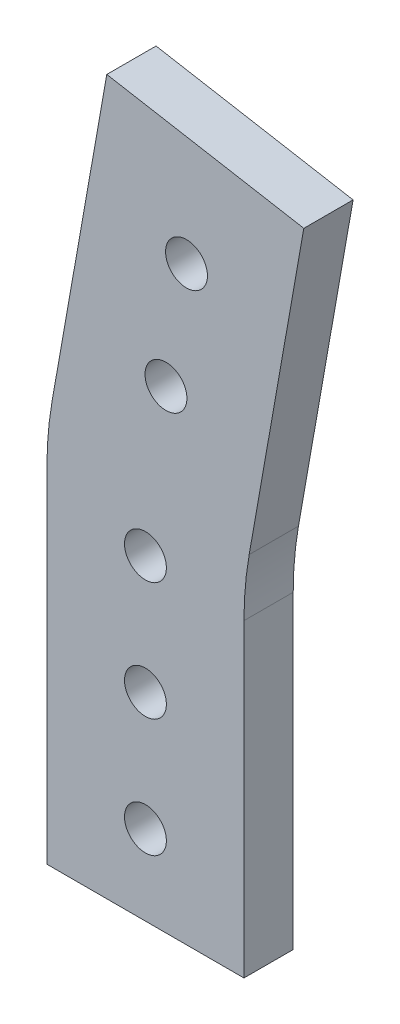
ISO-10303-21;
HEADER;
FILE_DESCRIPTION(('STEP AP214'),'2;1');
FILE_NAME('part.step','',(''),(''),'','','');
FILE_SCHEMA(('AUTOMOTIVE_DESIGN { 1 0 10303 214 1 1 1 1 }'));
ENDSEC;
DATA;
#1=APPLICATION_CONTEXT('core data for automotive mechanical design processes');
#2=APPLICATION_PROTOCOL_DEFINITION('international standard','automotive_design',2000,#1);
#3=PRODUCT_CONTEXT('',#1,'mechanical');
#4=PRODUCT('Part','Part','',(#3));
#5=PRODUCT_RELATED_PRODUCT_CATEGORY('part','',(#4));
#6=PRODUCT_DEFINITION_FORMATION('','',#4);
#7=PRODUCT_DEFINITION_CONTEXT('part definition',#1,'design');
#8=PRODUCT_DEFINITION('design','',#6,#7);
#9=PRODUCT_DEFINITION_SHAPE('','',#8);
#10=(LENGTH_UNIT() NAMED_UNIT(*) SI_UNIT(.MILLI.,.METRE.));
#11=(NAMED_UNIT(*) PLANE_ANGLE_UNIT() SI_UNIT($,.RADIAN.));
#12=(NAMED_UNIT(*) SI_UNIT($,.STERADIAN.) SOLID_ANGLE_UNIT());
#13=UNCERTAINTY_MEASURE_WITH_UNIT(LENGTH_MEASURE(1.E-05),#10,'distance_accuracy_value','');
#14=(GEOMETRIC_REPRESENTATION_CONTEXT(3) GLOBAL_UNCERTAINTY_ASSIGNED_CONTEXT((#13)) GLOBAL_UNIT_ASSIGNED_CONTEXT((#10,
#11,#12)) REPRESENTATION_CONTEXT('',''));
#15=CARTESIAN_POINT('',(0.,0.,0.));
#16=DIRECTION('',(0.,0.,1.));
#17=DIRECTION('',(1.,0.,0.));
#18=AXIS2_PLACEMENT_3D('',#15,#16,#17);
#19=CARTESIAN_POINT('',(0.,0.,5.));
#20=DIRECTION('',(0.,0.,-1.));
#21=DIRECTION('',(-1.,0.,0.));
#22=AXIS2_PLACEMENT_3D('',#19,#20,#21);
#23=PLANE('',#22);
#24=DIRECTION('',(-0.173648177666923,-0.984807753012209,0.));
#25=VECTOR('',#24,1.);
#26=CARTESIAN_POINT('',(0.,38.,5.));
#27=LINE('',#26,#25);
#28=CARTESIAN_POINT('',(6.07768621834231,72.4682713554273,5.));
#29=VERTEX_POINT('',#28);
#30=CARTESIAN_POINT('',(0.531728644572675,41.0155829949351,5.));
#31=VERTEX_POINT('',#30);
#32=EDGE_CURVE('E154',#29,#31,#27,.T.);
#33=ORIENTED_EDGE('',*,*,#32,.T.);
#34=CARTESIAN_POINT('',(35.,34.9378967765928,5.));
#35=DIRECTION('',(0.,0.,-1.));
#36=DIRECTION('',(-1.,0.,0.));
#37=AXIS2_PLACEMENT_3D('',#34,#35,#36);
#38=CIRCLE('',#37,35.);
#39=CARTESIAN_POINT('',(0.,34.9378967765928,5.));
#40=VERTEX_POINT('',#39);
#41=EDGE_CURVE('E132',#31,#40,#38,.F.);
#42=ORIENTED_EDGE('',*,*,#41,.T.);
#43=DIRECTION('',(0.,-1.,0.));
#44=VECTOR('',#43,1.);
#45=CARTESIAN_POINT('',(0.,0.,5.));
#46=LINE('',#45,#44);
#47=CARTESIAN_POINT('',(0.,0.,5.));
#48=VERTEX_POINT('',#47);
#49=EDGE_CURVE('E109',#40,#48,#46,.T.);
#50=ORIENTED_EDGE('',*,*,#49,.T.);
#51=DIRECTION('',(1.,0.,0.));
#52=VECTOR('',#51,1.);
#53=CARTESIAN_POINT('',(20.,0.,5.));
#54=LINE('',#53,#52);
#55=CARTESIAN_POINT('',(20.,0.,5.));
#56=VERTEX_POINT('',#55);
#57=EDGE_CURVE('E103',#48,#56,#54,.T.);
#58=ORIENTED_EDGE('',*,*,#57,.T.);
#59=DIRECTION('',(0.,1.,0.));
#60=VECTOR('',#59,1.);
#61=CARTESIAN_POINT('',(20.,34.4734603858308,5.));
#62=LINE('',#61,#60);
#63=CARTESIAN_POINT('',(20.,31.4113571624237,5.));
#64=VERTEX_POINT('',#63);
#65=EDGE_CURVE('E96',#56,#64,#62,.T.);
#66=ORIENTED_EDGE('',*,*,#65,.T.);
#67=CARTESIAN_POINT('',(55.,31.4113571624237,5.));
#68=DIRECTION('',(0.,0.,-1.));
#69=DIRECTION('',(-1.,0.,0.));
#70=AXIS2_PLACEMENT_3D('',#67,#68,#69);
#71=CIRCLE('',#70,35.);
#72=CARTESIAN_POINT('',(20.5317286445727,37.489043380766,5.));
#73=VERTEX_POINT('',#72);
#74=EDGE_CURVE('E11',#64,#73,#71,.T.);
#75=ORIENTED_EDGE('',*,*,#74,.T.);
#76=DIRECTION('',(0.173648177666923,0.984807753012209,0.));
#77=VECTOR('',#76,1.);
#78=CARTESIAN_POINT('',(26.0776862183423,68.9417317412582,5.));
#79=LINE('',#78,#77);
#80=CARTESIAN_POINT('',(26.0776862183423,68.9417317412582,5.));
#81=VERTEX_POINT('',#80);
#82=EDGE_CURVE('E102',#73,#81,#79,.T.);
#83=ORIENTED_EDGE('',*,*,#82,.T.);
#84=DIRECTION('',(-0.984807753012209,0.173648177666923,0.));
#85=VECTOR('',#84,1.);
#86=CARTESIAN_POINT('',(6.07768621834231,72.4682713554273,5.));
#87=LINE('',#86,#85);
#88=EDGE_CURVE('E152',#81,#29,#87,.T.);
#89=ORIENTED_EDGE('',*,*,#88,.T.);
#90=EDGE_LOOP('',(#33,#42,#50,#58,#66,#75,#83,#89));
#91=FACE_BOUND('',#90,.T.);
#92=CARTESIAN_POINT('',(10.,32.1183650964577,5.));
#93=DIRECTION('',(0.,0.,1.));
#94=DIRECTION('',(1.,0.,0.));
#95=AXIS2_PLACEMENT_3D('',#92,#93,#94);
#96=CIRCLE('',#95,2.125);
#97=CARTESIAN_POINT('',(12.125,32.1183650964577,5.));
#98=VERTEX_POINT('',#97);
#99=EDGE_CURVE('E160',#98,#98,#96,.T.);
#100=ORIENTED_EDGE('',*,*,#99,.F.);
#101=EDGE_LOOP('',(#100));
#102=FACE_BOUND('',#101,.T.);
#103=CARTESIAN_POINT('',(10.,20.1183650964577,5.));
#104=DIRECTION('',(0.,0.,1.));
#105=DIRECTION('',(1.,0.,0.));
#106=AXIS2_PLACEMENT_3D('',#103,#104,#105);
#107=CIRCLE('',#106,2.125);
#108=CARTESIAN_POINT('',(12.125,20.1183650964577,5.));
#109=VERTEX_POINT('',#108);
#110=EDGE_CURVE('E244',#109,#109,#107,.T.);
#111=ORIENTED_EDGE('',*,*,#110,.F.);
#112=EDGE_LOOP('',(#111));
#113=FACE_BOUND('',#112,.T.);
#114=CARTESIAN_POINT('',(10.,8.1183650964577,5.));
#115=DIRECTION('',(0.,0.,1.));
#116=DIRECTION('',(1.,0.,0.));
#117=AXIS2_PLACEMENT_3D('',#114,#115,#116);
#118=CIRCLE('',#117,2.125);
#119=CARTESIAN_POINT('',(12.125,8.1183650964577,5.));
#120=VERTEX_POINT('',#119);
#121=EDGE_CURVE('E238',#120,#120,#118,.T.);
#122=ORIENTED_EDGE('',*,*,#121,.F.);
#123=EDGE_LOOP('',(#122));
#124=FACE_BOUND('',#123,.T.);
#125=CARTESIAN_POINT('',(14.1675562640062,59.8721162652085,5.));
#126=DIRECTION('',(0.,0.,1.));
#127=DIRECTION('',(1.,0.,0.));
#128=AXIS2_PLACEMENT_3D('',#125,#126,#127);
#129=CIRCLE('',#128,2.125);
#130=CARTESIAN_POINT('',(16.2925562640062,59.8721162652085,5.));
#131=VERTEX_POINT('',#130);
#132=EDGE_CURVE('E232',#131,#131,#129,.T.);
#133=ORIENTED_EDGE('',*,*,#132,.F.);
#134=EDGE_LOOP('',(#133));
#135=FACE_BOUND('',#134,.T.);
#136=CARTESIAN_POINT('',(12.0837781320031,48.0544232290619,5.));
#137=DIRECTION('',(0.,0.,1.));
#138=DIRECTION('',(1.,0.,0.));
#139=AXIS2_PLACEMENT_3D('',#136,#137,#138);
#140=CIRCLE('',#139,2.125);
#141=CARTESIAN_POINT('',(14.2087781320031,48.0544232290619,5.));
#142=VERTEX_POINT('',#141);
#143=EDGE_CURVE('E223',#142,#142,#140,.T.);
#144=ORIENTED_EDGE('',*,*,#143,.F.);
#145=EDGE_LOOP('',(#144));
#146=FACE_BOUND('',#145,.T.);
#147=ADVANCED_FACE('F34',(#91,#102,#113,#124,#135,#146),#23,.F.);
#148=CARTESIAN_POINT('',(0.,0.,0.));
#149=DIRECTION('',(0.,0.,-1.));
#150=DIRECTION('',(-1.,0.,0.));
#151=AXIS2_PLACEMENT_3D('',#148,#149,#150);
#152=PLANE('',#151);
#153=CARTESIAN_POINT('',(14.1675562640062,59.8721162652085,0.));
#154=DIRECTION('',(0.,0.,1.));
#155=DIRECTION('',(1.,0.,0.));
#156=AXIS2_PLACEMENT_3D('',#153,#154,#155);
#157=CIRCLE('',#156,2.125);
#158=CARTESIAN_POINT('',(16.2925562640062,59.8721162652085,0.));
#159=VERTEX_POINT('',#158);
#160=EDGE_CURVE('E229',#159,#159,#157,.T.);
#161=ORIENTED_EDGE('',*,*,#160,.T.);
#162=EDGE_LOOP('',(#161));
#163=FACE_BOUND('',#162,.T.);
#164=CARTESIAN_POINT('',(10.,20.1183650964577,0.));
#165=DIRECTION('',(0.,0.,1.));
#166=DIRECTION('',(1.,0.,0.));
#167=AXIS2_PLACEMENT_3D('',#164,#165,#166);
#168=CIRCLE('',#167,2.125);
#169=CARTESIAN_POINT('',(12.125,20.1183650964577,0.));
#170=VERTEX_POINT('',#169);
#171=EDGE_CURVE('E241',#170,#170,#168,.T.);
#172=ORIENTED_EDGE('',*,*,#171,.T.);
#173=EDGE_LOOP('',(#172));
#174=FACE_BOUND('',#173,.T.);
#175=DIRECTION('',(0.,-1.,0.));
#176=VECTOR('',#175,1.);
#177=CARTESIAN_POINT('',(0.,0.,0.));
#178=LINE('',#177,#176);
#179=CARTESIAN_POINT('',(0.,34.9378967765928,0.));
#180=VERTEX_POINT('',#179);
#181=CARTESIAN_POINT('',(0.,0.,0.));
#182=VERTEX_POINT('',#181);
#183=EDGE_CURVE('E113',#180,#182,#178,.T.);
#184=ORIENTED_EDGE('',*,*,#183,.F.);
#185=CARTESIAN_POINT('',(35.,34.9378967765928,0.));
#186=DIRECTION('',(0.,0.,-1.));
#187=DIRECTION('',(-1.,0.,0.));
#188=AXIS2_PLACEMENT_3D('',#185,#186,#187);
#189=CIRCLE('',#188,35.);
#190=CARTESIAN_POINT('',(0.531728644572675,41.0155829949351,0.));
#191=VERTEX_POINT('',#190);
#192=EDGE_CURVE('E122',#180,#191,#189,.T.);
#193=ORIENTED_EDGE('',*,*,#192,.T.);
#194=DIRECTION('',(-0.173648177666923,-0.984807753012209,0.));
#195=VECTOR('',#194,1.);
#196=CARTESIAN_POINT('',(0.,38.,0.));
#197=LINE('',#196,#195);
#198=CARTESIAN_POINT('',(6.07768621834231,72.4682713554273,0.));
#199=VERTEX_POINT('',#198);
#200=EDGE_CURVE('E165',#199,#191,#197,.T.);
#201=ORIENTED_EDGE('',*,*,#200,.F.);
#202=DIRECTION('',(-0.984807753012209,0.173648177666923,0.));
#203=VECTOR('',#202,1.);
#204=CARTESIAN_POINT('',(6.07768621834231,72.4682713554273,0.));
#205=LINE('',#204,#203);
#206=CARTESIAN_POINT('',(26.0776862183423,68.9417317412582,0.));
#207=VERTEX_POINT('',#206);
#208=EDGE_CURVE('E163',#207,#199,#205,.T.);
#209=ORIENTED_EDGE('',*,*,#208,.F.);
#210=DIRECTION('',(0.173648177666923,0.984807753012209,0.));
#211=VECTOR('',#210,1.);
#212=CARTESIAN_POINT('',(26.0776862183423,68.9417317412582,0.));
#213=LINE('',#212,#211);
#214=CARTESIAN_POINT('',(20.5317286445727,37.489043380766,0.));
#215=VERTEX_POINT('',#214);
#216=EDGE_CURVE('E144',#215,#207,#213,.T.);
#217=ORIENTED_EDGE('',*,*,#216,.F.);
#218=CARTESIAN_POINT('',(55.,31.4113571624237,0.));
#219=DIRECTION('',(0.,0.,-1.));
#220=DIRECTION('',(-1.,0.,0.));
#221=AXIS2_PLACEMENT_3D('',#218,#219,#220);
#222=CIRCLE('',#221,35.);
#223=CARTESIAN_POINT('',(20.,31.4113571624237,0.));
#224=VERTEX_POINT('',#223);
#225=EDGE_CURVE('E42',#215,#224,#222,.F.);
#226=ORIENTED_EDGE('',*,*,#225,.T.);
#227=DIRECTION('',(0.,1.,0.));
#228=VECTOR('',#227,1.);
#229=CARTESIAN_POINT('',(20.,34.4734603858308,0.));
#230=LINE('',#229,#228);
#231=CARTESIAN_POINT('',(20.,0.,0.));
#232=VERTEX_POINT('',#231);
#233=EDGE_CURVE('E142',#232,#224,#230,.T.);
#234=ORIENTED_EDGE('',*,*,#233,.F.);
#235=DIRECTION('',(1.,0.,0.));
#236=VECTOR('',#235,1.);
#237=CARTESIAN_POINT('',(20.,0.,0.));
#238=LINE('',#237,#236);
#239=EDGE_CURVE('E117',#182,#232,#238,.T.);
#240=ORIENTED_EDGE('',*,*,#239,.F.);
#241=EDGE_LOOP('',(#184,#193,#201,#209,#217,#226,#234,#240));
#242=FACE_BOUND('',#241,.T.);
#243=CARTESIAN_POINT('',(10.,32.1183650964577,0.));
#244=DIRECTION('',(0.,0.,1.));
#245=DIRECTION('',(1.,0.,0.));
#246=AXIS2_PLACEMENT_3D('',#243,#244,#245);
#247=CIRCLE('',#246,2.125);
#248=CARTESIAN_POINT('',(12.125,32.1183650964577,0.));
#249=VERTEX_POINT('',#248);
#250=EDGE_CURVE('E247',#249,#249,#247,.T.);
#251=ORIENTED_EDGE('',*,*,#250,.T.);
#252=EDGE_LOOP('',(#251));
#253=FACE_BOUND('',#252,.T.);
#254=CARTESIAN_POINT('',(10.,8.1183650964577,0.));
#255=DIRECTION('',(0.,0.,1.));
#256=DIRECTION('',(1.,0.,0.));
#257=AXIS2_PLACEMENT_3D('',#254,#255,#256);
#258=CIRCLE('',#257,2.125);
#259=CARTESIAN_POINT('',(12.125,8.1183650964577,0.));
#260=VERTEX_POINT('',#259);
#261=EDGE_CURVE('E235',#260,#260,#258,.T.);
#262=ORIENTED_EDGE('',*,*,#261,.T.);
#263=EDGE_LOOP('',(#262));
#264=FACE_BOUND('',#263,.T.);
#265=CARTESIAN_POINT('',(12.0837781320031,48.0544232290619,0.));
#266=DIRECTION('',(0.,0.,1.));
#267=DIRECTION('',(1.,0.,0.));
#268=AXIS2_PLACEMENT_3D('',#265,#266,#267);
#269=CIRCLE('',#268,2.125);
#270=CARTESIAN_POINT('',(14.2087781320031,48.0544232290619,0.));
#271=VERTEX_POINT('',#270);
#272=EDGE_CURVE('E226',#271,#271,#269,.T.);
#273=ORIENTED_EDGE('',*,*,#272,.T.);
#274=EDGE_LOOP('',(#273));
#275=FACE_BOUND('',#274,.T.);
#276=ADVANCED_FACE('F140',(#163,#174,#242,#253,#264,#275),#152,.T.);
#277=CARTESIAN_POINT('',(20.,0.,5.));
#278=DIRECTION('',(0.,1.,0.));
#279=DIRECTION('',(0.,0.,1.));
#280=AXIS2_PLACEMENT_3D('',#277,#278,#279);
#281=PLANE('',#280);
#282=ORIENTED_EDGE('',*,*,#239,.T.);
#283=DIRECTION('',(0.,0.,-1.));
#284=VECTOR('',#283,1.);
#285=CARTESIAN_POINT('',(20.,0.,5.));
#286=LINE('',#285,#284);
#287=EDGE_CURVE('E100',#56,#232,#286,.T.);
#288=ORIENTED_EDGE('',*,*,#287,.F.);
#289=ORIENTED_EDGE('',*,*,#57,.F.);
#290=DIRECTION('',(0.,0.,-1.));
#291=VECTOR('',#290,1.);
#292=CARTESIAN_POINT('',(0.,0.,5.));
#293=LINE('',#292,#291);
#294=EDGE_CURVE('E159',#48,#182,#293,.T.);
#295=ORIENTED_EDGE('',*,*,#294,.T.);
#296=EDGE_LOOP('',(#282,#288,#289,#295));
#297=FACE_BOUND('',#296,.T.);
#298=ADVANCED_FACE('F115',(#297),#281,.F.);
#299=CARTESIAN_POINT('',(20.,34.4734603858308,5.));
#300=DIRECTION('',(-1.,0.,0.));
#301=DIRECTION('',(0.,0.,1.));
#302=AXIS2_PLACEMENT_3D('',#299,#300,#301);
#303=PLANE('',#302);
#304=ORIENTED_EDGE('',*,*,#233,.T.);
#305=DIRECTION('',(0.,0.,-1.));
#306=VECTOR('',#305,1.);
#307=CARTESIAN_POINT('',(20.,31.4113571624237,5.));
#308=LINE('',#307,#306);
#309=EDGE_CURVE('E55',#224,#64,#308,.F.);
#310=ORIENTED_EDGE('',*,*,#309,.T.);
#311=ORIENTED_EDGE('',*,*,#65,.F.);
#312=ORIENTED_EDGE('',*,*,#287,.T.);
#313=EDGE_LOOP('',(#304,#310,#311,#312));
#314=FACE_BOUND('',#313,.T.);
#315=ADVANCED_FACE('F98',(#314),#303,.F.);
#316=CARTESIAN_POINT('',(26.0776862183423,68.9417317412582,5.));
#317=DIRECTION('',(-0.984807753012209,0.173648177666923,0.));
#318=DIRECTION('',(-0.173648177666923,-0.984807753012209,0.));
#319=AXIS2_PLACEMENT_3D('',#316,#317,#318);
#320=PLANE('',#319);
#321=ORIENTED_EDGE('',*,*,#82,.F.);
#322=DIRECTION('',(0.,0.,-1.));
#323=VECTOR('',#322,1.);
#324=CARTESIAN_POINT('',(20.5317286445727,37.489043380766,0.));
#325=LINE('',#324,#323);
#326=EDGE_CURVE('E134',#73,#215,#325,.T.);
#327=ORIENTED_EDGE('',*,*,#326,.T.);
#328=ORIENTED_EDGE('',*,*,#216,.T.);
#329=DIRECTION('',(0.,0.,-1.));
#330=VECTOR('',#329,1.);
#331=CARTESIAN_POINT('',(26.0776862183423,68.9417317412582,5.));
#332=LINE('',#331,#330);
#333=EDGE_CURVE('E119',#81,#207,#332,.T.);
#334=ORIENTED_EDGE('',*,*,#333,.F.);
#335=EDGE_LOOP('',(#321,#327,#328,#334));
#336=FACE_BOUND('',#335,.T.);
#337=ADVANCED_FACE('F149',(#336),#320,.F.);
#338=CARTESIAN_POINT('',(6.07768621834231,72.4682713554273,5.));
#339=DIRECTION('',(-0.173648177666923,-0.984807753012209,0.));
#340=DIRECTION('',(0.984807753012209,-0.173648177666923,0.));
#341=AXIS2_PLACEMENT_3D('',#338,#339,#340);
#342=PLANE('',#341);
#343=ORIENTED_EDGE('',*,*,#208,.T.);
#344=DIRECTION('',(0.,0.,-1.));
#345=VECTOR('',#344,1.);
#346=CARTESIAN_POINT('',(6.07768621834231,72.4682713554273,5.));
#347=LINE('',#346,#345);
#348=EDGE_CURVE('E125',#29,#199,#347,.T.);
#349=ORIENTED_EDGE('',*,*,#348,.F.);
#350=ORIENTED_EDGE('',*,*,#88,.F.);
#351=ORIENTED_EDGE('',*,*,#333,.T.);
#352=EDGE_LOOP('',(#343,#349,#350,#351));
#353=FACE_BOUND('',#352,.T.);
#354=ADVANCED_FACE('F193',(#353),#342,.F.);
#355=CARTESIAN_POINT('',(0.,38.,5.));
#356=DIRECTION('',(0.984807753012209,-0.173648177666923,0.));
#357=DIRECTION('',(0.173648177666923,0.984807753012209,0.));
#358=AXIS2_PLACEMENT_3D('',#355,#356,#357);
#359=PLANE('',#358);
#360=ORIENTED_EDGE('',*,*,#200,.T.);
#361=DIRECTION('',(0.,0.,-1.));
#362=VECTOR('',#361,1.);
#363=CARTESIAN_POINT('',(0.531728644572676,41.0155829949351,5.));
#364=LINE('',#363,#362);
#365=EDGE_CURVE('E130',#191,#31,#364,.F.);
#366=ORIENTED_EDGE('',*,*,#365,.T.);
#367=ORIENTED_EDGE('',*,*,#32,.F.);
#368=ORIENTED_EDGE('',*,*,#348,.T.);
#369=EDGE_LOOP('',(#360,#366,#367,#368));
#370=FACE_BOUND('',#369,.T.);
#371=ADVANCED_FACE('F174',(#370),#359,.F.);
#372=CARTESIAN_POINT('',(0.,0.,5.));
#373=DIRECTION('',(1.,0.,0.));
#374=DIRECTION('',(0.,0.,-1.));
#375=AXIS2_PLACEMENT_3D('',#372,#373,#374);
#376=PLANE('',#375);
#377=ORIENTED_EDGE('',*,*,#49,.F.);
#378=DIRECTION('',(0.,0.,-1.));
#379=VECTOR('',#378,1.);
#380=CARTESIAN_POINT('',(0.,34.9378967765928,5.));
#381=LINE('',#380,#379);
#382=EDGE_CURVE('E118',#40,#180,#381,.T.);
#383=ORIENTED_EDGE('',*,*,#382,.T.);
#384=ORIENTED_EDGE('',*,*,#183,.T.);
#385=ORIENTED_EDGE('',*,*,#294,.F.);
#386=EDGE_LOOP('',(#377,#383,#384,#385));
#387=FACE_BOUND('',#386,.T.);
#388=ADVANCED_FACE('F182',(#387),#376,.F.);
#389=CARTESIAN_POINT('',(10.,32.1183650964577,5.));
#390=DIRECTION('',(0.,0.,-1.));
#391=DIRECTION('',(-1.,0.,0.));
#392=AXIS2_PLACEMENT_3D('',#389,#390,#391);
#393=CYLINDRICAL_SURFACE('',#392,2.125);
#394=ORIENTED_EDGE('',*,*,#99,.T.);
#395=EDGE_LOOP('',(#394));
#396=FACE_BOUND('',#395,.T.);
#397=ORIENTED_EDGE('',*,*,#250,.F.);
#398=EDGE_LOOP('',(#397));
#399=FACE_BOUND('',#398,.T.);
#400=ADVANCED_FACE('F184',(#396,#399),#393,.F.);
#401=CARTESIAN_POINT('',(10.,20.1183650964577,5.));
#402=DIRECTION('',(0.,0.,-1.));
#403=DIRECTION('',(-1.,0.,0.));
#404=AXIS2_PLACEMENT_3D('',#401,#402,#403);
#405=CYLINDRICAL_SURFACE('',#404,2.125);
#406=ORIENTED_EDGE('',*,*,#110,.T.);
#407=EDGE_LOOP('',(#406));
#408=FACE_BOUND('',#407,.T.);
#409=ORIENTED_EDGE('',*,*,#171,.F.);
#410=EDGE_LOOP('',(#409));
#411=FACE_BOUND('',#410,.T.);
#412=ADVANCED_FACE('F190',(#408,#411),#405,.F.);
#413=CARTESIAN_POINT('',(10.,8.1183650964577,5.));
#414=DIRECTION('',(0.,0.,-1.));
#415=DIRECTION('',(-1.,0.,0.));
#416=AXIS2_PLACEMENT_3D('',#413,#414,#415);
#417=CYLINDRICAL_SURFACE('',#416,2.125);
#418=ORIENTED_EDGE('',*,*,#121,.T.);
#419=EDGE_LOOP('',(#418));
#420=FACE_BOUND('',#419,.T.);
#421=ORIENTED_EDGE('',*,*,#261,.F.);
#422=EDGE_LOOP('',(#421));
#423=FACE_BOUND('',#422,.T.);
#424=ADVANCED_FACE('F205',(#420,#423),#417,.F.);
#425=CARTESIAN_POINT('',(14.1675562640062,59.8721162652085,5.));
#426=DIRECTION('',(0.,0.,-1.));
#427=DIRECTION('',(-1.,0.,0.));
#428=AXIS2_PLACEMENT_3D('',#425,#426,#427);
#429=CYLINDRICAL_SURFACE('',#428,2.125);
#430=ORIENTED_EDGE('',*,*,#132,.T.);
#431=EDGE_LOOP('',(#430));
#432=FACE_BOUND('',#431,.T.);
#433=ORIENTED_EDGE('',*,*,#160,.F.);
#434=EDGE_LOOP('',(#433));
#435=FACE_BOUND('',#434,.T.);
#436=ADVANCED_FACE('F209',(#432,#435),#429,.F.);
#437=CARTESIAN_POINT('',(12.0837781320031,48.0544232290619,5.));
#438=DIRECTION('',(0.,0.,-1.));
#439=DIRECTION('',(-1.,0.,0.));
#440=AXIS2_PLACEMENT_3D('',#437,#438,#439);
#441=CYLINDRICAL_SURFACE('',#440,2.125);
#442=ORIENTED_EDGE('',*,*,#143,.T.);
#443=EDGE_LOOP('',(#442));
#444=FACE_BOUND('',#443,.T.);
#445=ORIENTED_EDGE('',*,*,#272,.F.);
#446=EDGE_LOOP('',(#445));
#447=FACE_BOUND('',#446,.T.);
#448=ADVANCED_FACE('F213',(#444,#447),#441,.F.);
#449=CARTESIAN_POINT('',(35.,34.9378967765928,5.));
#450=DIRECTION('',(0.,0.,-1.));
#451=DIRECTION('',(-1.,0.,0.));
#452=AXIS2_PLACEMENT_3D('',#449,#450,#451);
#453=CYLINDRICAL_SURFACE('',#452,35.);
#454=ORIENTED_EDGE('',*,*,#41,.F.);
#455=ORIENTED_EDGE('',*,*,#365,.F.);
#456=ORIENTED_EDGE('',*,*,#192,.F.);
#457=ORIENTED_EDGE('',*,*,#382,.F.);
#458=EDGE_LOOP('',(#454,#455,#456,#457));
#459=FACE_BOUND('',#458,.T.);
#460=ADVANCED_FACE('F180',(#459),#453,.T.);
#461=CARTESIAN_POINT('',(55.,31.4113571624237,5.));
#462=DIRECTION('',(0.,0.,1.));
#463=DIRECTION('',(1.,0.,0.));
#464=AXIS2_PLACEMENT_3D('',#461,#462,#463);
#465=CYLINDRICAL_SURFACE('',#464,35.);
#466=ORIENTED_EDGE('',*,*,#74,.F.);
#467=ORIENTED_EDGE('',*,*,#309,.F.);
#468=ORIENTED_EDGE('',*,*,#225,.F.);
#469=ORIENTED_EDGE('',*,*,#326,.F.);
#470=EDGE_LOOP('',(#466,#467,#468,#469));
#471=FACE_BOUND('',#470,.T.);
#472=ADVANCED_FACE('F36',(#471),#465,.F.);
#473=CLOSED_SHELL('',(#147,#276,#298,#315,#337,#354,#371,#388,#400,#412,#424,#436,#448,#460,#472));
#474=MANIFOLD_SOLID_BREP('B2',#473);
#475=ADVANCED_BREP_SHAPE_REPRESENTATION('',(#18,#474),#14);
#476=SHAPE_DEFINITION_REPRESENTATION(#9,#475);
ENDSEC;
END-ISO-10303-21;
